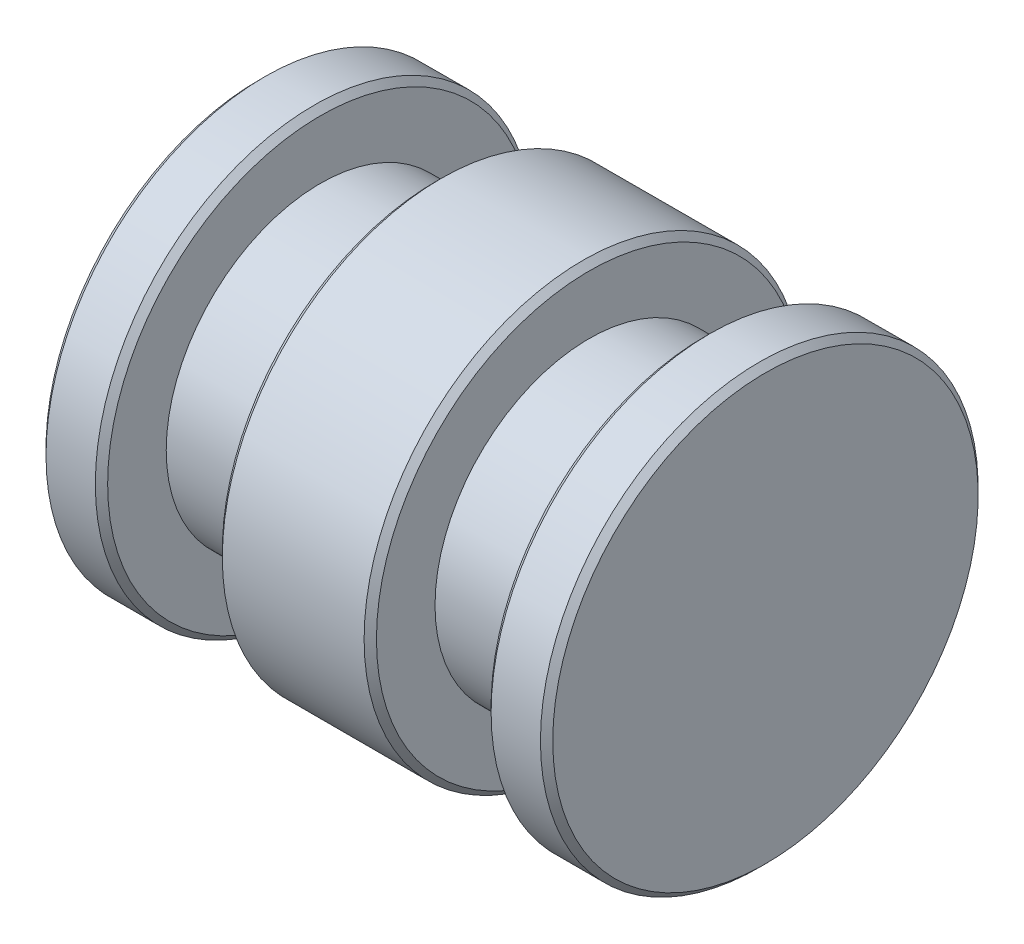
ISO-10303-21;
HEADER;
FILE_DESCRIPTION(('STEP AP214'),'2;1');
FILE_NAME('part.step','',(''),(''),'','','');
FILE_SCHEMA(('AUTOMOTIVE_DESIGN { 1 0 10303 214 1 1 1 1 }'));
ENDSEC;
DATA;
#1=APPLICATION_CONTEXT('core data for automotive mechanical design processes');
#2=APPLICATION_PROTOCOL_DEFINITION('international standard','automotive_design',2000,#1);
#3=PRODUCT_CONTEXT('',#1,'mechanical');
#4=PRODUCT('Part','Part','',(#3));
#5=PRODUCT_RELATED_PRODUCT_CATEGORY('part','',(#4));
#6=PRODUCT_DEFINITION_FORMATION('','',#4);
#7=PRODUCT_DEFINITION_CONTEXT('part definition',#1,'design');
#8=PRODUCT_DEFINITION('design','',#6,#7);
#9=PRODUCT_DEFINITION_SHAPE('','',#8);
#10=(LENGTH_UNIT() NAMED_UNIT(*) SI_UNIT(.MILLI.,.METRE.));
#11=(NAMED_UNIT(*) PLANE_ANGLE_UNIT() SI_UNIT($,.RADIAN.));
#12=(NAMED_UNIT(*) SI_UNIT($,.STERADIAN.) SOLID_ANGLE_UNIT());
#13=UNCERTAINTY_MEASURE_WITH_UNIT(LENGTH_MEASURE(1.E-05),#10,'distance_accuracy_value','');
#14=(GEOMETRIC_REPRESENTATION_CONTEXT(3) GLOBAL_UNCERTAINTY_ASSIGNED_CONTEXT((#13)) GLOBAL_UNIT_ASSIGNED_CONTEXT((#10,
#11,#12)) REPRESENTATION_CONTEXT('',''));
#15=CARTESIAN_POINT('',(0.,0.,0.));
#16=DIRECTION('',(0.,0.,1.));
#17=DIRECTION('',(1.,0.,0.));
#18=AXIS2_PLACEMENT_3D('',#15,#16,#17);
#19=CARTESIAN_POINT('',(-1.61741962375833,0.,0.));
#20=DIRECTION('',(-1.,0.,0.));
#21=DIRECTION('',(0.,0.,1.));
#22=AXIS2_PLACEMENT_3D('',#19,#20,#21);
#23=CYLINDRICAL_SURFACE('',#22,4.5085);
#24=CARTESIAN_POINT('',(1.143,0.,0.));
#25=DIRECTION('',(-1.,0.,0.));
#26=DIRECTION('',(0.,0.,1.));
#27=AXIS2_PLACEMENT_3D('',#24,#25,#26);
#28=CIRCLE('',#27,4.5085);
#29=CARTESIAN_POINT('',(1.143,0.,4.5085));
#30=VERTEX_POINT('',#29);
#31=EDGE_CURVE('E49',#30,#30,#28,.T.);
#32=ORIENTED_EDGE('',*,*,#31,.T.);
#33=EDGE_LOOP('',(#32));
#34=FACE_BOUND('',#33,.T.);
#35=CARTESIAN_POINT('',(0.127000000000001,0.,0.));
#36=DIRECTION('',(1.,0.,0.));
#37=DIRECTION('',(0.,0.,-1.));
#38=AXIS2_PLACEMENT_3D('',#35,#36,#37);
#39=CIRCLE('',#38,4.5085);
#40=CARTESIAN_POINT('',(0.127000000000001,0.,-4.5085));
#41=VERTEX_POINT('',#40);
#42=EDGE_CURVE('E53',#41,#41,#39,.T.);
#43=ORIENTED_EDGE('',*,*,#42,.T.);
#44=EDGE_LOOP('',(#43));
#45=FACE_BOUND('',#44,.T.);
#46=ADVANCED_FACE('F37',(#34,#45),#23,.T.);
#47=CARTESIAN_POINT('',(0.,0.,0.));
#48=DIRECTION('',(1.,0.,0.));
#49=DIRECTION('',(0.,0.,-1.));
#50=AXIS2_PLACEMENT_3D('',#47,#48,#49);
#51=PLANE('',#50);
#52=CARTESIAN_POINT('',(0.,0.,0.));
#53=DIRECTION('',(1.,0.,0.));
#54=DIRECTION('',(0.,0.,-1.));
#55=AXIS2_PLACEMENT_3D('',#52,#53,#54);
#56=CIRCLE('',#55,4.3815);
#57=CARTESIAN_POINT('',(0.,0.,-4.3815));
#58=VERTEX_POINT('',#57);
#59=EDGE_CURVE('E10',#58,#58,#56,.F.);
#60=ORIENTED_EDGE('',*,*,#59,.T.);
#61=EDGE_LOOP('',(#60));
#62=FACE_BOUND('',#61,.T.);
#63=ADVANCED_FACE('F115',(#62),#51,.F.);
#64=CARTESIAN_POINT('',(10.4394,4.5085,0.));
#65=DIRECTION('',(-1.,0.,0.));
#66=DIRECTION('',(0.,0.,1.));
#67=AXIS2_PLACEMENT_3D('',#64,#65,#66);
#68=PLANE('',#67);
#69=CARTESIAN_POINT('',(10.4394,0.,0.));
#70=DIRECTION('',(-1.,0.,0.));
#71=DIRECTION('',(0.,0.,1.));
#72=AXIS2_PLACEMENT_3D('',#69,#70,#71);
#73=CIRCLE('',#72,4.3815);
#74=CARTESIAN_POINT('',(10.4394,0.,4.3815));
#75=VERTEX_POINT('',#74);
#76=EDGE_CURVE('E61',#75,#75,#73,.F.);
#77=ORIENTED_EDGE('',*,*,#76,.T.);
#78=EDGE_LOOP('',(#77));
#79=FACE_BOUND('',#78,.T.);
#80=ADVANCED_FACE('F121',(#79),#68,.F.);
#81=CARTESIAN_POINT('',(-1.61741962375833,0.,0.));
#82=DIRECTION('',(-1.,0.,0.));
#83=DIRECTION('',(0.,0.,1.));
#84=AXIS2_PLACEMENT_3D('',#81,#82,#83);
#85=CYLINDRICAL_SURFACE('',#84,4.5085);
#86=CARTESIAN_POINT('',(9.2964,0.,0.));
#87=DIRECTION('',(1.,0.,0.));
#88=DIRECTION('',(0.,0.,-1.));
#89=AXIS2_PLACEMENT_3D('',#86,#87,#88);
#90=CIRCLE('',#89,4.5085);
#91=CARTESIAN_POINT('',(9.2964,0.,-4.5085));
#92=VERTEX_POINT('',#91);
#93=EDGE_CURVE('E64',#92,#92,#90,.T.);
#94=ORIENTED_EDGE('',*,*,#93,.T.);
#95=EDGE_LOOP('',(#94));
#96=FACE_BOUND('',#95,.T.);
#97=CARTESIAN_POINT('',(10.3124,0.,0.));
#98=DIRECTION('',(-1.,0.,0.));
#99=DIRECTION('',(0.,0.,1.));
#100=AXIS2_PLACEMENT_3D('',#97,#98,#99);
#101=CIRCLE('',#100,4.5085);
#102=CARTESIAN_POINT('',(10.3124,0.,4.5085));
#103=VERTEX_POINT('',#102);
#104=EDGE_CURVE('E67',#103,#103,#101,.T.);
#105=ORIENTED_EDGE('',*,*,#104,.T.);
#106=EDGE_LOOP('',(#105));
#107=FACE_BOUND('',#106,.T.);
#108=ADVANCED_FACE('F238',(#96,#107),#85,.T.);
#109=CARTESIAN_POINT('',(9.1694,4.5085,0.));
#110=DIRECTION('',(1.,0.,0.));
#111=DIRECTION('',(0.,0.,-1.));
#112=AXIS2_PLACEMENT_3D('',#109,#110,#111);
#113=PLANE('',#112);
#114=CARTESIAN_POINT('',(9.1694,0.,0.));
#115=DIRECTION('',(1.,0.,0.));
#116=DIRECTION('',(0.,0.,-1.));
#117=AXIS2_PLACEMENT_3D('',#114,#115,#116);
#118=CIRCLE('',#117,4.3815);
#119=CARTESIAN_POINT('',(9.1694,0.,-4.3815));
#120=VERTEX_POINT('',#119);
#121=EDGE_CURVE('E70',#120,#120,#118,.F.);
#122=ORIENTED_EDGE('',*,*,#121,.T.);
#123=EDGE_LOOP('',(#122));
#124=FACE_BOUND('',#123,.T.);
#125=CARTESIAN_POINT('',(9.1694,0.,0.));
#126=DIRECTION('',(-1.,0.,0.));
#127=DIRECTION('',(0.,0.,1.));
#128=AXIS2_PLACEMENT_3D('',#125,#126,#127);
#129=CIRCLE('',#128,3.175);
#130=CARTESIAN_POINT('',(9.1694,0.,3.175));
#131=VERTEX_POINT('',#130);
#132=EDGE_CURVE('E82',#131,#131,#129,.T.);
#133=ORIENTED_EDGE('',*,*,#132,.F.);
#134=EDGE_LOOP('',(#133));
#135=FACE_BOUND('',#134,.T.);
#136=ADVANCED_FACE('F233',(#124,#135),#113,.F.);
#137=CARTESIAN_POINT('',(-1.61741962375833,0.,0.));
#138=DIRECTION('',(-1.,0.,0.));
#139=DIRECTION('',(0.,0.,1.));
#140=AXIS2_PLACEMENT_3D('',#137,#138,#139);
#141=CYLINDRICAL_SURFACE('',#140,3.175);
#142=CARTESIAN_POINT('',(6.8072,0.,0.));
#143=DIRECTION('',(-1.,0.,0.));
#144=DIRECTION('',(0.,0.,1.));
#145=AXIS2_PLACEMENT_3D('',#142,#143,#144);
#146=CIRCLE('',#145,3.175);
#147=CARTESIAN_POINT('',(6.8072,0.,3.175));
#148=VERTEX_POINT('',#147);
#149=EDGE_CURVE('E85',#148,#148,#146,.T.);
#150=ORIENTED_EDGE('',*,*,#149,.F.);
#151=EDGE_LOOP('',(#150));
#152=FACE_BOUND('',#151,.T.);
#153=ORIENTED_EDGE('',*,*,#132,.T.);
#154=EDGE_LOOP('',(#153));
#155=FACE_BOUND('',#154,.T.);
#156=ADVANCED_FACE('F225',(#152,#155),#141,.T.);
#157=CARTESIAN_POINT('',(6.8072,3.175,0.));
#158=DIRECTION('',(-1.,0.,0.));
#159=DIRECTION('',(0.,0.,1.));
#160=AXIS2_PLACEMENT_3D('',#157,#158,#159);
#161=PLANE('',#160);
#162=CARTESIAN_POINT('',(6.8072,0.,0.));
#163=DIRECTION('',(-1.,0.,0.));
#164=DIRECTION('',(0.,0.,1.));
#165=AXIS2_PLACEMENT_3D('',#162,#163,#164);
#166=CIRCLE('',#165,4.3815);
#167=CARTESIAN_POINT('',(6.8072,0.,4.3815));
#168=VERTEX_POINT('',#167);
#169=EDGE_CURVE('E73',#168,#168,#166,.F.);
#170=ORIENTED_EDGE('',*,*,#169,.T.);
#171=EDGE_LOOP('',(#170));
#172=FACE_BOUND('',#171,.T.);
#173=ORIENTED_EDGE('',*,*,#149,.T.);
#174=EDGE_LOOP('',(#173));
#175=FACE_BOUND('',#174,.T.);
#176=ADVANCED_FACE('F111',(#172,#175),#161,.F.);
#177=CARTESIAN_POINT('',(-1.61741962375833,0.,0.));
#178=DIRECTION('',(-1.,0.,0.));
#179=DIRECTION('',(0.,0.,1.));
#180=AXIS2_PLACEMENT_3D('',#177,#178,#179);
#181=CYLINDRICAL_SURFACE('',#180,4.5085);
#182=CARTESIAN_POINT('',(6.6802,0.,0.));
#183=DIRECTION('',(-1.,0.,0.));
#184=DIRECTION('',(0.,0.,1.));
#185=AXIS2_PLACEMENT_3D('',#182,#183,#184);
#186=CIRCLE('',#185,4.5085);
#187=CARTESIAN_POINT('',(6.6802,0.,4.5085));
#188=VERTEX_POINT('',#187);
#189=EDGE_CURVE('E76',#188,#188,#186,.T.);
#190=ORIENTED_EDGE('',*,*,#189,.T.);
#191=EDGE_LOOP('',(#190));
#192=FACE_BOUND('',#191,.T.);
#193=CARTESIAN_POINT('',(3.7592,0.,0.));
#194=DIRECTION('',(1.,0.,0.));
#195=DIRECTION('',(0.,0.,-1.));
#196=AXIS2_PLACEMENT_3D('',#193,#194,#195);
#197=CIRCLE('',#196,4.5085);
#198=CARTESIAN_POINT('',(3.7592,0.,-4.5085));
#199=VERTEX_POINT('',#198);
#200=EDGE_CURVE('E79',#199,#199,#197,.T.);
#201=ORIENTED_EDGE('',*,*,#200,.T.);
#202=EDGE_LOOP('',(#201));
#203=FACE_BOUND('',#202,.T.);
#204=ADVANCED_FACE('F105',(#192,#203),#181,.T.);
#205=CARTESIAN_POINT('',(3.6322,4.5085,0.));
#206=DIRECTION('',(1.,0.,0.));
#207=DIRECTION('',(0.,0.,-1.));
#208=AXIS2_PLACEMENT_3D('',#205,#206,#207);
#209=PLANE('',#208);
#210=CARTESIAN_POINT('',(3.6322,0.,0.));
#211=DIRECTION('',(1.,0.,0.));
#212=DIRECTION('',(0.,0.,-1.));
#213=AXIS2_PLACEMENT_3D('',#210,#211,#212);
#214=CIRCLE('',#213,4.3815);
#215=CARTESIAN_POINT('',(3.6322,0.,-4.3815));
#216=VERTEX_POINT('',#215);
#217=EDGE_CURVE('E58',#216,#216,#214,.F.);
#218=ORIENTED_EDGE('',*,*,#217,.T.);
#219=EDGE_LOOP('',(#218));
#220=FACE_BOUND('',#219,.T.);
#221=CARTESIAN_POINT('',(3.6322,0.,0.));
#222=DIRECTION('',(-1.,0.,0.));
#223=DIRECTION('',(0.,0.,1.));
#224=AXIS2_PLACEMENT_3D('',#221,#222,#223);
#225=CIRCLE('',#224,3.175);
#226=CARTESIAN_POINT('',(3.6322,0.,3.175));
#227=VERTEX_POINT('',#226);
#228=EDGE_CURVE('E88',#227,#227,#225,.T.);
#229=ORIENTED_EDGE('',*,*,#228,.F.);
#230=EDGE_LOOP('',(#229));
#231=FACE_BOUND('',#230,.T.);
#232=ADVANCED_FACE('F100',(#220,#231),#209,.F.);
#233=CARTESIAN_POINT('',(-1.61741962375833,0.,0.));
#234=DIRECTION('',(-1.,0.,0.));
#235=DIRECTION('',(0.,0.,1.));
#236=AXIS2_PLACEMENT_3D('',#233,#234,#235);
#237=CYLINDRICAL_SURFACE('',#236,3.175);
#238=CARTESIAN_POINT('',(1.27,0.,0.));
#239=DIRECTION('',(-1.,0.,0.));
#240=DIRECTION('',(0.,0.,1.));
#241=AXIS2_PLACEMENT_3D('',#238,#239,#240);
#242=CIRCLE('',#241,3.175);
#243=CARTESIAN_POINT('',(1.27,0.,3.175));
#244=VERTEX_POINT('',#243);
#245=EDGE_CURVE('E91',#244,#244,#242,.T.);
#246=ORIENTED_EDGE('',*,*,#245,.F.);
#247=EDGE_LOOP('',(#246));
#248=FACE_BOUND('',#247,.T.);
#249=ORIENTED_EDGE('',*,*,#228,.T.);
#250=EDGE_LOOP('',(#249));
#251=FACE_BOUND('',#250,.T.);
#252=ADVANCED_FACE('F97',(#248,#251),#237,.T.);
#253=CARTESIAN_POINT('',(1.27,3.175,0.));
#254=DIRECTION('',(-1.,0.,0.));
#255=DIRECTION('',(0.,0.,1.));
#256=AXIS2_PLACEMENT_3D('',#253,#254,#255);
#257=PLANE('',#256);
#258=CARTESIAN_POINT('',(1.27,0.,0.));
#259=DIRECTION('',(-1.,0.,0.));
#260=DIRECTION('',(0.,0.,1.));
#261=AXIS2_PLACEMENT_3D('',#258,#259,#260);
#262=CIRCLE('',#261,4.3815);
#263=CARTESIAN_POINT('',(1.27,0.,4.3815));
#264=VERTEX_POINT('',#263);
#265=EDGE_CURVE('E45',#264,#264,#262,.F.);
#266=ORIENTED_EDGE('',*,*,#265,.T.);
#267=EDGE_LOOP('',(#266));
#268=FACE_BOUND('',#267,.T.);
#269=ORIENTED_EDGE('',*,*,#245,.T.);
#270=EDGE_LOOP('',(#269));
#271=FACE_BOUND('',#270,.T.);
#272=ADVANCED_FACE('F95',(#268,#271),#257,.F.);
#273=CARTESIAN_POINT('',(6.6802,0.,0.));
#274=DIRECTION('',(-1.,0.,0.));
#275=DIRECTION('',(0.,0.,1.));
#276=AXIS2_PLACEMENT_3D('',#273,#274,#275);
#277=CONICAL_SURFACE('',#276,4.5085,0.785398163397445);
#278=ORIENTED_EDGE('',*,*,#169,.F.);
#279=EDGE_LOOP('',(#278));
#280=FACE_BOUND('',#279,.T.);
#281=ORIENTED_EDGE('',*,*,#189,.F.);
#282=EDGE_LOOP('',(#281));
#283=FACE_BOUND('',#282,.T.);
#284=ADVANCED_FACE('F127',(#280,#283),#277,.T.);
#285=CARTESIAN_POINT('',(9.1694,0.,0.));
#286=DIRECTION('',(1.,0.,0.));
#287=DIRECTION('',(0.,0.,-1.));
#288=AXIS2_PLACEMENT_3D('',#285,#286,#287);
#289=CONICAL_SURFACE('',#288,4.3815,0.785398163397448);
#290=ORIENTED_EDGE('',*,*,#93,.F.);
#291=EDGE_LOOP('',(#290));
#292=FACE_BOUND('',#291,.T.);
#293=ORIENTED_EDGE('',*,*,#121,.F.);
#294=EDGE_LOOP('',(#293));
#295=FACE_BOUND('',#294,.T.);
#296=ADVANCED_FACE('F133',(#292,#295),#289,.T.);
#297=CARTESIAN_POINT('',(10.3124,0.,0.));
#298=DIRECTION('',(-1.,0.,0.));
#299=DIRECTION('',(0.,0.,1.));
#300=AXIS2_PLACEMENT_3D('',#297,#298,#299);
#301=CONICAL_SURFACE('',#300,4.5085,0.785398163397445);
#302=ORIENTED_EDGE('',*,*,#76,.F.);
#303=EDGE_LOOP('',(#302));
#304=FACE_BOUND('',#303,.T.);
#305=ORIENTED_EDGE('',*,*,#104,.F.);
#306=EDGE_LOOP('',(#305));
#307=FACE_BOUND('',#306,.T.);
#308=ADVANCED_FACE('F140',(#304,#307),#301,.T.);
#309=CARTESIAN_POINT('',(3.6322,0.,0.));
#310=DIRECTION('',(1.,0.,0.));
#311=DIRECTION('',(0.,0.,-1.));
#312=AXIS2_PLACEMENT_3D('',#309,#310,#311);
#313=CONICAL_SURFACE('',#312,4.3815,0.785398163397448);
#314=ORIENTED_EDGE('',*,*,#200,.F.);
#315=EDGE_LOOP('',(#314));
#316=FACE_BOUND('',#315,.T.);
#317=ORIENTED_EDGE('',*,*,#217,.F.);
#318=EDGE_LOOP('',(#317));
#319=FACE_BOUND('',#318,.T.);
#320=ADVANCED_FACE('F147',(#316,#319),#313,.T.);
#321=CARTESIAN_POINT('',(1.143,0.,0.));
#322=DIRECTION('',(-1.,0.,0.));
#323=DIRECTION('',(0.,0.,1.));
#324=AXIS2_PLACEMENT_3D('',#321,#322,#323);
#325=CONICAL_SURFACE('',#324,4.5085,0.785398163397452);
#326=ORIENTED_EDGE('',*,*,#265,.F.);
#327=EDGE_LOOP('',(#326));
#328=FACE_BOUND('',#327,.T.);
#329=ORIENTED_EDGE('',*,*,#31,.F.);
#330=EDGE_LOOP('',(#329));
#331=FACE_BOUND('',#330,.T.);
#332=ADVANCED_FACE('F153',(#328,#331),#325,.T.);
#333=CARTESIAN_POINT('',(0.,0.,0.));
#334=DIRECTION('',(1.,0.,0.));
#335=DIRECTION('',(0.,0.,-1.));
#336=AXIS2_PLACEMENT_3D('',#333,#334,#335);
#337=CONICAL_SURFACE('',#336,4.3815,0.785398163397448);
#338=ORIENTED_EDGE('',*,*,#42,.F.);
#339=EDGE_LOOP('',(#338));
#340=FACE_BOUND('',#339,.T.);
#341=ORIENTED_EDGE('',*,*,#59,.F.);
#342=EDGE_LOOP('',(#341));
#343=FACE_BOUND('',#342,.T.);
#344=ADVANCED_FACE('F40',(#340,#343),#337,.T.);
#345=CLOSED_SHELL('',(#46,#63,#80,#108,#136,#156,#176,#204,#232,#252,#272,#284,#296,#308,#320,
#332,#344));
#346=MANIFOLD_SOLID_BREP('B2',#345);
#347=ADVANCED_BREP_SHAPE_REPRESENTATION('',(#18,#346),#14);
#348=SHAPE_DEFINITION_REPRESENTATION(#9,#347);
ENDSEC;
END-ISO-10303-21;
